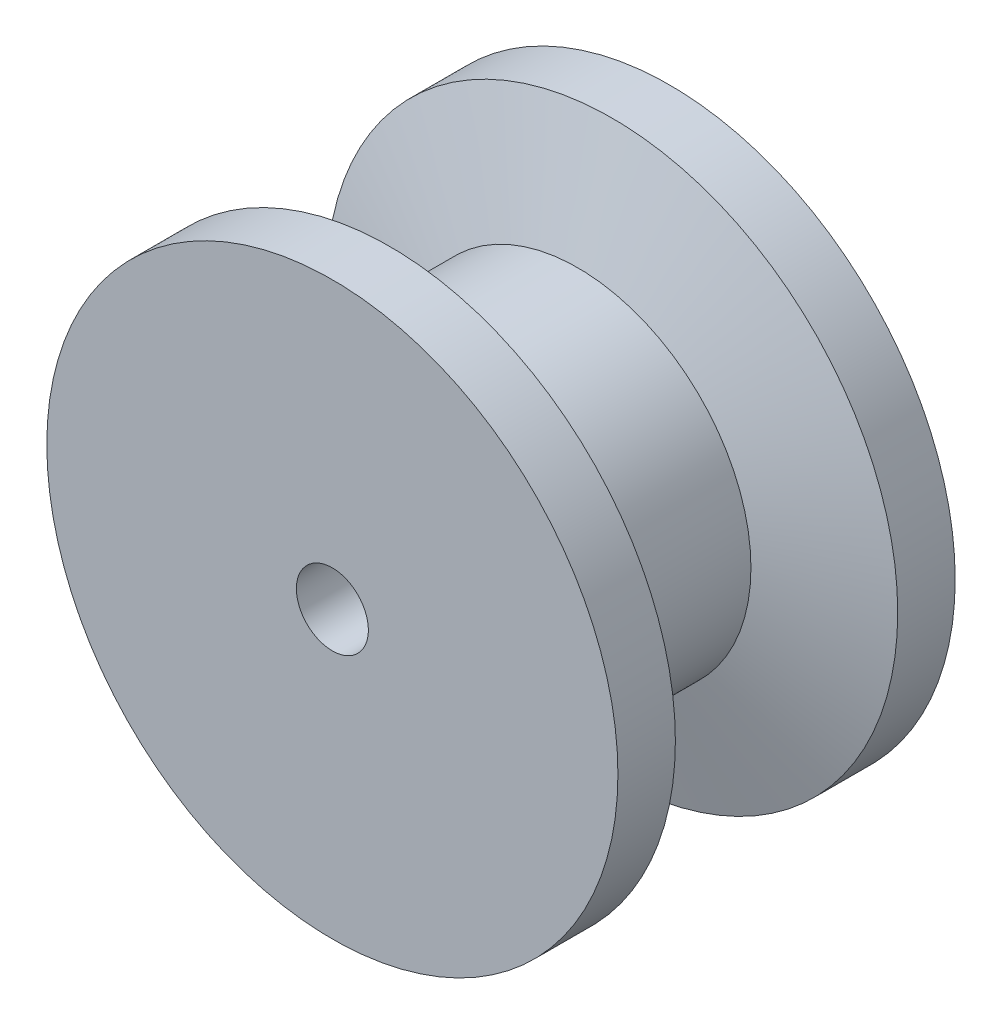
ISO-10303-21;
HEADER;
FILE_DESCRIPTION(('STEP AP214'),'2;1');
FILE_NAME('part.step','',(''),(''),'','','');
FILE_SCHEMA(('AUTOMOTIVE_DESIGN { 1 0 10303 214 1 1 1 1 }'));
ENDSEC;
DATA;
#1=APPLICATION_CONTEXT('core data for automotive mechanical design processes');
#2=APPLICATION_PROTOCOL_DEFINITION('international standard','automotive_design',2000,#1);
#3=PRODUCT_CONTEXT('',#1,'mechanical');
#4=PRODUCT('Part','Part','',(#3));
#5=PRODUCT_RELATED_PRODUCT_CATEGORY('part','',(#4));
#6=PRODUCT_DEFINITION_FORMATION('','',#4);
#7=PRODUCT_DEFINITION_CONTEXT('part definition',#1,'design');
#8=PRODUCT_DEFINITION('design','',#6,#7);
#9=PRODUCT_DEFINITION_SHAPE('','',#8);
#10=(LENGTH_UNIT() NAMED_UNIT(*) SI_UNIT(.MILLI.,.METRE.));
#11=(NAMED_UNIT(*) PLANE_ANGLE_UNIT() SI_UNIT($,.RADIAN.));
#12=(NAMED_UNIT(*) SI_UNIT($,.STERADIAN.) SOLID_ANGLE_UNIT());
#13=UNCERTAINTY_MEASURE_WITH_UNIT(LENGTH_MEASURE(1.E-05),#10,'distance_accuracy_value','');
#14=(GEOMETRIC_REPRESENTATION_CONTEXT(3) GLOBAL_UNCERTAINTY_ASSIGNED_CONTEXT((#13)) GLOBAL_UNIT_ASSIGNED_CONTEXT((#10,
#11,#12)) REPRESENTATION_CONTEXT('',''));
#15=CARTESIAN_POINT('',(0.,0.,0.));
#16=DIRECTION('',(0.,0.,1.));
#17=DIRECTION('',(1.,0.,0.));
#18=AXIS2_PLACEMENT_3D('',#15,#16,#17);
#19=CARTESIAN_POINT('',(0.,0.,9.525));
#20=DIRECTION('',(0.,0.,-1.));
#21=DIRECTION('',(-1.,0.,0.));
#22=AXIS2_PLACEMENT_3D('',#19,#20,#21);
#23=PLANE('',#22);
#24=CARTESIAN_POINT('',(0.,0.,9.525));
#25=DIRECTION('',(0.,0.,-1.));
#26=DIRECTION('',(-1.,0.,0.));
#27=AXIS2_PLACEMENT_3D('',#24,#25,#26);
#28=CIRCLE('',#27,2.032);
#29=CARTESIAN_POINT('',(-2.032,0.,9.525));
#30=VERTEX_POINT('',#29);
#31=EDGE_CURVE('E76',#30,#30,#28,.T.);
#32=ORIENTED_EDGE('',*,*,#31,.T.);
#33=EDGE_LOOP('',(#32));
#34=FACE_BOUND('',#33,.T.);
#35=CARTESIAN_POINT('',(0.,0.,9.525));
#36=DIRECTION('',(0.,0.,1.));
#37=DIRECTION('',(1.,0.,0.));
#38=AXIS2_PLACEMENT_3D('',#35,#36,#37);
#39=CIRCLE('',#38,16.129);
#40=CARTESIAN_POINT('',(16.129,0.,9.525));
#41=VERTEX_POINT('',#40);
#42=EDGE_CURVE('E10',#41,#41,#39,.T.);
#43=ORIENTED_EDGE('',*,*,#42,.T.);
#44=EDGE_LOOP('',(#43));
#45=FACE_BOUND('',#44,.T.);
#46=ADVANCED_FACE('F45',(#34,#45),#23,.F.);
#47=CARTESIAN_POINT('',(0.,0.,9.525));
#48=DIRECTION('',(0.,0.,1.));
#49=DIRECTION('',(1.,0.,0.));
#50=AXIS2_PLACEMENT_3D('',#47,#48,#49);
#51=CYLINDRICAL_SURFACE('',#50,16.129);
#52=ORIENTED_EDGE('',*,*,#42,.F.);
#53=EDGE_LOOP('',(#52));
#54=FACE_BOUND('',#53,.T.);
#55=CARTESIAN_POINT('',(0.,0.,6.27929491363124));
#56=DIRECTION('',(0.,0.,1.));
#57=DIRECTION('',(1.,0.,0.));
#58=AXIS2_PLACEMENT_3D('',#55,#56,#57);
#59=CIRCLE('',#58,16.129);
#60=CARTESIAN_POINT('',(16.129,0.,6.27929491363124));
#61=VERTEX_POINT('',#60);
#62=EDGE_CURVE('E52',#61,#61,#59,.T.);
#63=ORIENTED_EDGE('',*,*,#62,.T.);
#64=EDGE_LOOP('',(#63));
#65=FACE_BOUND('',#64,.T.);
#66=ADVANCED_FACE('F111',(#54,#65),#51,.T.);
#67=CARTESIAN_POINT('',(0.,0.,4.33790508636876));
#68=DIRECTION('',(0.,0.,1.));
#69=DIRECTION('',(1.,0.,0.));
#70=AXIS2_PLACEMENT_3D('',#67,#68,#69);
#71=CONICAL_SURFACE('',#70,9.779,1.27409035395586);
#72=ORIENTED_EDGE('',*,*,#62,.F.);
#73=EDGE_LOOP('',(#72));
#74=FACE_BOUND('',#73,.T.);
#75=CARTESIAN_POINT('',(0.,0.,4.33790508636876));
#76=DIRECTION('',(0.,0.,1.));
#77=DIRECTION('',(1.,0.,0.));
#78=AXIS2_PLACEMENT_3D('',#75,#76,#77);
#79=CIRCLE('',#78,9.779);
#80=CARTESIAN_POINT('',(9.779,0.,4.33790508636876));
#81=VERTEX_POINT('',#80);
#82=EDGE_CURVE('E57',#81,#81,#79,.T.);
#83=ORIENTED_EDGE('',*,*,#82,.T.);
#84=EDGE_LOOP('',(#83));
#85=FACE_BOUND('',#84,.T.);
#86=ADVANCED_FACE('F115',(#74,#85),#71,.T.);
#87=CARTESIAN_POINT('',(0.,0.,9.525));
#88=DIRECTION('',(0.,0.,1.));
#89=DIRECTION('',(1.,0.,0.));
#90=AXIS2_PLACEMENT_3D('',#87,#88,#89);
#91=CYLINDRICAL_SURFACE('',#90,9.779);
#92=ORIENTED_EDGE('',*,*,#82,.F.);
#93=EDGE_LOOP('',(#92));
#94=FACE_BOUND('',#93,.T.);
#95=CARTESIAN_POINT('',(0.,0.,-4.33790508636876));
#96=DIRECTION('',(0.,0.,1.));
#97=DIRECTION('',(1.,0.,0.));
#98=AXIS2_PLACEMENT_3D('',#95,#96,#97);
#99=CIRCLE('',#98,9.779);
#100=CARTESIAN_POINT('',(9.779,0.,-4.33790508636876));
#101=VERTEX_POINT('',#100);
#102=EDGE_CURVE('E62',#101,#101,#99,.T.);
#103=ORIENTED_EDGE('',*,*,#102,.T.);
#104=EDGE_LOOP('',(#103));
#105=FACE_BOUND('',#104,.T.);
#106=ADVANCED_FACE('F107',(#94,#105),#91,.T.);
#107=CARTESIAN_POINT('',(0.,0.,-6.27929491363124));
#108=DIRECTION('',(0.,0.,-1.));
#109=DIRECTION('',(-1.,0.,0.));
#110=AXIS2_PLACEMENT_3D('',#107,#108,#109);
#111=CONICAL_SURFACE('',#110,16.129,1.27409035395586);
#112=ORIENTED_EDGE('',*,*,#102,.F.);
#113=EDGE_LOOP('',(#112));
#114=FACE_BOUND('',#113,.T.);
#115=CARTESIAN_POINT('',(0.,0.,-6.27929491363124));
#116=DIRECTION('',(0.,0.,1.));
#117=DIRECTION('',(1.,0.,0.));
#118=AXIS2_PLACEMENT_3D('',#115,#116,#117);
#119=CIRCLE('',#118,16.129);
#120=CARTESIAN_POINT('',(16.129,0.,-6.27929491363124));
#121=VERTEX_POINT('',#120);
#122=EDGE_CURVE('E68',#121,#121,#119,.T.);
#123=ORIENTED_EDGE('',*,*,#122,.T.);
#124=EDGE_LOOP('',(#123));
#125=FACE_BOUND('',#124,.T.);
#126=ADVANCED_FACE('F100',(#114,#125),#111,.T.);
#127=CARTESIAN_POINT('',(0.,0.,9.525));
#128=DIRECTION('',(0.,0.,1.));
#129=DIRECTION('',(1.,0.,0.));
#130=AXIS2_PLACEMENT_3D('',#127,#128,#129);
#131=CYLINDRICAL_SURFACE('',#130,16.129);
#132=ORIENTED_EDGE('',*,*,#122,.F.);
#133=EDGE_LOOP('',(#132));
#134=FACE_BOUND('',#133,.T.);
#135=CARTESIAN_POINT('',(0.,0.,-9.525));
#136=DIRECTION('',(0.,0.,1.));
#137=DIRECTION('',(1.,0.,0.));
#138=AXIS2_PLACEMENT_3D('',#135,#136,#137);
#139=CIRCLE('',#138,16.129);
#140=CARTESIAN_POINT('',(16.129,0.,-9.525));
#141=VERTEX_POINT('',#140);
#142=EDGE_CURVE('E72',#141,#141,#139,.T.);
#143=ORIENTED_EDGE('',*,*,#142,.T.);
#144=EDGE_LOOP('',(#143));
#145=FACE_BOUND('',#144,.T.);
#146=ADVANCED_FACE('F95',(#134,#145),#131,.T.);
#147=CARTESIAN_POINT('',(0.,16.129,-9.525));
#148=DIRECTION('',(0.,0.,1.));
#149=DIRECTION('',(1.,0.,0.));
#150=AXIS2_PLACEMENT_3D('',#147,#148,#149);
#151=PLANE('',#150);
#152=CARTESIAN_POINT('',(0.,0.,-9.525));
#153=DIRECTION('',(0.,0.,-1.));
#154=DIRECTION('',(-1.,0.,0.));
#155=AXIS2_PLACEMENT_3D('',#152,#153,#154);
#156=CIRCLE('',#155,2.032);
#157=CARTESIAN_POINT('',(-2.032,0.,-9.525));
#158=VERTEX_POINT('',#157);
#159=EDGE_CURVE('E77',#158,#158,#156,.T.);
#160=ORIENTED_EDGE('',*,*,#159,.F.);
#161=EDGE_LOOP('',(#160));
#162=FACE_BOUND('',#161,.T.);
#163=ORIENTED_EDGE('',*,*,#142,.F.);
#164=EDGE_LOOP('',(#163));
#165=FACE_BOUND('',#164,.T.);
#166=ADVANCED_FACE('F89',(#162,#165),#151,.F.);
#167=CARTESIAN_POINT('',(0.,0.,9.525));
#168=DIRECTION('',(0.,0.,-1.));
#169=DIRECTION('',(-1.,0.,0.));
#170=AXIS2_PLACEMENT_3D('',#167,#168,#169);
#171=CYLINDRICAL_SURFACE('',#170,2.032);
#172=ORIENTED_EDGE('',*,*,#31,.F.);
#173=EDGE_LOOP('',(#172));
#174=FACE_BOUND('',#173,.T.);
#175=ORIENTED_EDGE('',*,*,#159,.T.);
#176=EDGE_LOOP('',(#175));
#177=FACE_BOUND('',#176,.T.);
#178=ADVANCED_FACE('F86',(#174,#177),#171,.F.);
#179=CLOSED_SHELL('',(#46,#66,#86,#106,#126,#146,#166,#178));
#180=MANIFOLD_SOLID_BREP('B2',#179);
#181=ADVANCED_BREP_SHAPE_REPRESENTATION('',(#18,#180),#14);
#182=SHAPE_DEFINITION_REPRESENTATION(#9,#181);
ENDSEC;
END-ISO-10303-21;
